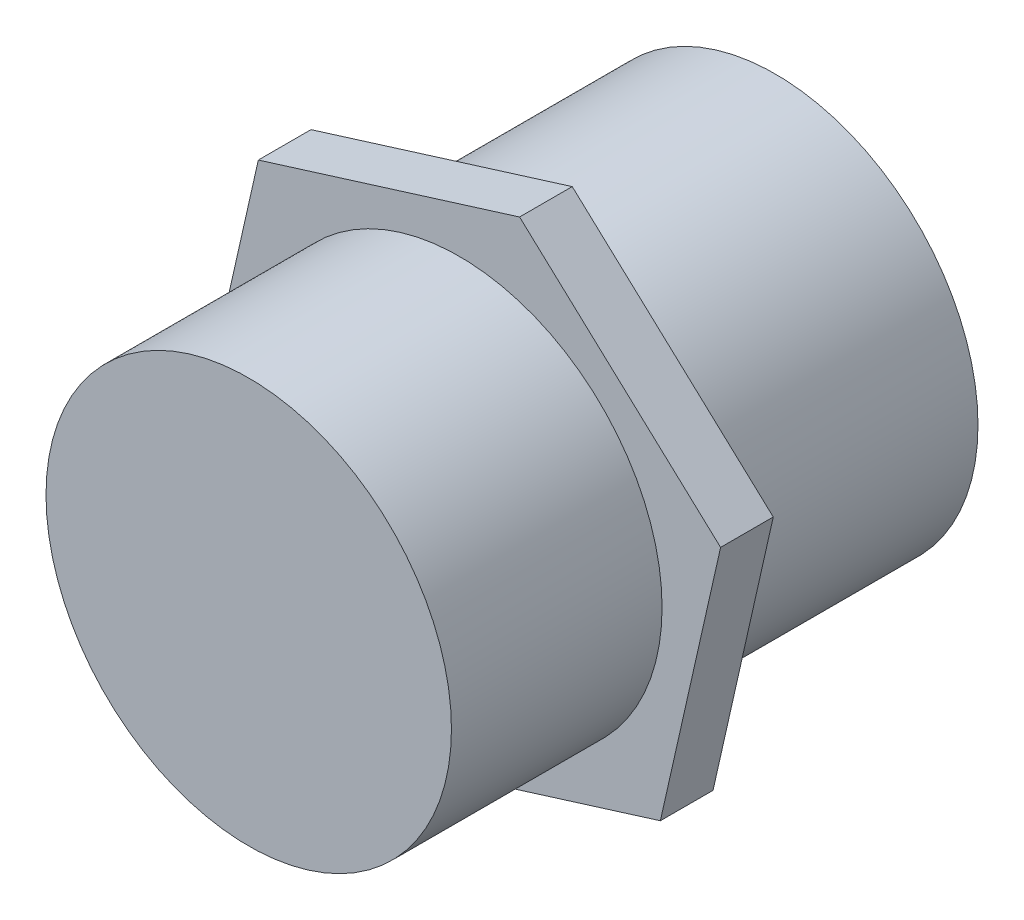
ISO-10303-21;
HEADER;
FILE_DESCRIPTION(('STEP AP214'),'2;1');
FILE_NAME('part.step','',(''),(''),'','','');
FILE_SCHEMA(('AUTOMOTIVE_DESIGN { 1 0 10303 214 1 1 1 1 }'));
ENDSEC;
DATA;
#1=APPLICATION_CONTEXT('core data for automotive mechanical design processes');
#2=APPLICATION_PROTOCOL_DEFINITION('international standard','automotive_design',2000,#1);
#3=PRODUCT_CONTEXT('',#1,'mechanical');
#4=PRODUCT('Part','Part','',(#3));
#5=PRODUCT_RELATED_PRODUCT_CATEGORY('part','',(#4));
#6=PRODUCT_DEFINITION_FORMATION('','',#4);
#7=PRODUCT_DEFINITION_CONTEXT('part definition',#1,'design');
#8=PRODUCT_DEFINITION('design','',#6,#7);
#9=PRODUCT_DEFINITION_SHAPE('','',#8);
#10=(LENGTH_UNIT() NAMED_UNIT(*) SI_UNIT(.MILLI.,.METRE.));
#11=(NAMED_UNIT(*) PLANE_ANGLE_UNIT() SI_UNIT($,.RADIAN.));
#12=(NAMED_UNIT(*) SI_UNIT($,.STERADIAN.) SOLID_ANGLE_UNIT());
#13=UNCERTAINTY_MEASURE_WITH_UNIT(LENGTH_MEASURE(1.E-05),#10,'distance_accuracy_value','');
#14=(GEOMETRIC_REPRESENTATION_CONTEXT(3) GLOBAL_UNCERTAINTY_ASSIGNED_CONTEXT((#13)) GLOBAL_UNIT_ASSIGNED_CONTEXT((#10,
#11,#12)) REPRESENTATION_CONTEXT('',''));
#15=CARTESIAN_POINT('',(0.,0.,0.));
#16=DIRECTION('',(0.,0.,1.));
#17=DIRECTION('',(1.,0.,0.));
#18=AXIS2_PLACEMENT_3D('',#15,#16,#17);
#19=CARTESIAN_POINT('',(-6.10543283287317,-6.61238912370365,2.));
#20=DIRECTION('',(0.678381425874796,0.734709902633739,0.));
#21=DIRECTION('',(-0.734709902633739,0.678381425874796,0.));
#22=AXIS2_PLACEMENT_3D('',#19,#20,#21);
#23=PLANE('',#22);
#24=DIRECTION('',(0.734709902633739,-0.678381425874796,0.));
#25=VECTOR('',#24,1.);
#26=CARTESIAN_POINT('',(-6.10543283287317,-6.61238912370365,0.));
#27=LINE('',#26,#25);
#28=CARTESIAN_POINT('',(-9.92309747343002,-3.08741583412515,0.));
#29=VERTEX_POINT('',#28);
#30=CARTESIAN_POINT('',(-2.28776819231631,-10.1373624132822,0.));
#31=VERTEX_POINT('',#30);
#32=EDGE_CURVE('E138',#29,#31,#27,.T.);
#33=ORIENTED_EDGE('',*,*,#32,.T.);
#34=DIRECTION('',(0.,0.,-1.));
#35=VECTOR('',#34,1.);
#36=CARTESIAN_POINT('',(-2.28776819231631,-10.1373624132822,2.));
#37=LINE('',#36,#35);
#38=CARTESIAN_POINT('',(-2.28776819231631,-10.1373624132822,2.));
#39=VERTEX_POINT('',#38);
#40=EDGE_CURVE('E12',#39,#31,#37,.T.);
#41=ORIENTED_EDGE('',*,*,#40,.F.);
#42=DIRECTION('',(0.734709902633739,-0.678381425874796,0.));
#43=VECTOR('',#42,1.);
#44=CARTESIAN_POINT('',(-6.10543283287317,-6.61238912370365,2.));
#45=LINE('',#44,#43);
#46=CARTESIAN_POINT('',(-9.92309747343002,-3.08741583412515,2.));
#47=VERTEX_POINT('',#46);
#48=EDGE_CURVE('E162',#47,#39,#45,.T.);
#49=ORIENTED_EDGE('',*,*,#48,.F.);
#50=DIRECTION('',(0.,0.,-1.));
#51=VECTOR('',#50,1.);
#52=CARTESIAN_POINT('',(-9.92309747343002,-3.08741583412515,2.));
#53=LINE('',#52,#51);
#54=EDGE_CURVE('E130',#47,#29,#53,.T.);
#55=ORIENTED_EDGE('',*,*,#54,.T.);
#56=EDGE_LOOP('',(#33,#41,#49,#55));
#57=FACE_BOUND('',#56,.T.);
#58=ADVANCED_FACE('F49',(#57),#23,.F.);
#59=CARTESIAN_POINT('',(2.6737805443987,-8.59365449621958,2.));
#60=DIRECTION('',(-0.297086727155411,0.954850499579953,0.));
#61=DIRECTION('',(-0.954850499579953,-0.297086727155411,0.));
#62=AXIS2_PLACEMENT_3D('',#59,#60,#61);
#63=PLANE('',#62);
#64=DIRECTION('',(0.954850499579953,0.297086727155411,0.));
#65=VECTOR('',#64,1.);
#66=CARTESIAN_POINT('',(2.6737805443987,-8.59365449621958,0.));
#67=LINE('',#66,#65);
#68=CARTESIAN_POINT('',(7.63532928111371,-7.049946579157,0.));
#69=VERTEX_POINT('',#68);
#70=EDGE_CURVE('E141',#31,#69,#67,.T.);
#71=ORIENTED_EDGE('',*,*,#70,.T.);
#72=DIRECTION('',(0.,0.,-1.));
#73=VECTOR('',#72,1.);
#74=CARTESIAN_POINT('',(7.63532928111371,-7.049946579157,2.));
#75=LINE('',#74,#73);
#76=CARTESIAN_POINT('',(7.63532928111371,-7.049946579157,2.));
#77=VERTEX_POINT('',#76);
#78=EDGE_CURVE('E58',#77,#69,#75,.T.);
#79=ORIENTED_EDGE('',*,*,#78,.F.);
#80=DIRECTION('',(0.954850499579953,0.297086727155411,0.));
#81=VECTOR('',#80,1.);
#82=CARTESIAN_POINT('',(2.6737805443987,-8.59365449621958,2.));
#83=LINE('',#82,#81);
#84=EDGE_CURVE('E103',#39,#77,#83,.T.);
#85=ORIENTED_EDGE('',*,*,#84,.F.);
#86=ORIENTED_EDGE('',*,*,#40,.T.);
#87=EDGE_LOOP('',(#71,#79,#85,#86));
#88=FACE_BOUND('',#87,.T.);
#89=ADVANCED_FACE('F176',(#88),#63,.F.);
#90=CARTESIAN_POINT('',(8.77921337727187,-1.98126537251593,2.));
#91=DIRECTION('',(-0.975468153030208,0.220140596946214,0.));
#92=DIRECTION('',(-0.220140596946214,-0.975468153030208,0.));
#93=AXIS2_PLACEMENT_3D('',#90,#91,#92);
#94=PLANE('',#93);
#95=DIRECTION('',(0.220140596946214,0.975468153030208,0.));
#96=VECTOR('',#95,1.);
#97=CARTESIAN_POINT('',(8.77921337727187,-1.98126537251593,0.));
#98=LINE('',#97,#96);
#99=CARTESIAN_POINT('',(9.92309747343002,3.08741583412515,0.));
#100=VERTEX_POINT('',#99);
#101=EDGE_CURVE('E143',#69,#100,#98,.T.);
#102=ORIENTED_EDGE('',*,*,#101,.T.);
#103=DIRECTION('',(0.,0.,-1.));
#104=VECTOR('',#103,1.);
#105=CARTESIAN_POINT('',(9.92309747343002,3.08741583412515,2.));
#106=LINE('',#105,#104);
#107=CARTESIAN_POINT('',(9.92309747343002,3.08741583412515,2.));
#108=VERTEX_POINT('',#107);
#109=EDGE_CURVE('E125',#108,#100,#106,.T.);
#110=ORIENTED_EDGE('',*,*,#109,.F.);
#111=DIRECTION('',(0.220140596946214,0.975468153030208,0.));
#112=VECTOR('',#111,1.);
#113=CARTESIAN_POINT('',(8.77921337727187,-1.98126537251593,2.));
#114=LINE('',#113,#112);
#115=EDGE_CURVE('E116',#77,#108,#114,.T.);
#116=ORIENTED_EDGE('',*,*,#115,.F.);
#117=ORIENTED_EDGE('',*,*,#78,.T.);
#118=EDGE_LOOP('',(#102,#110,#116,#117));
#119=FACE_BOUND('',#118,.T.);
#120=ADVANCED_FACE('F155',(#119),#94,.F.);
#121=CARTESIAN_POINT('',(6.10543283287317,6.61238912370365,2.));
#122=DIRECTION('',(-0.678381425874796,-0.734709902633739,0.));
#123=DIRECTION('',(0.734709902633739,-0.678381425874796,0.));
#124=AXIS2_PLACEMENT_3D('',#121,#122,#123);
#125=PLANE('',#124);
#126=DIRECTION('',(-0.734709902633739,0.678381425874796,0.));
#127=VECTOR('',#126,1.);
#128=CARTESIAN_POINT('',(6.10543283287317,6.61238912370365,0.));
#129=LINE('',#128,#127);
#130=CARTESIAN_POINT('',(2.28776819231631,10.1373624132822,0.));
#131=VERTEX_POINT('',#130);
#132=EDGE_CURVE('E124',#100,#131,#129,.T.);
#133=ORIENTED_EDGE('',*,*,#132,.T.);
#134=DIRECTION('',(0.,0.,-1.));
#135=VECTOR('',#134,1.);
#136=CARTESIAN_POINT('',(2.28776819231631,10.1373624132822,2.));
#137=LINE('',#136,#135);
#138=CARTESIAN_POINT('',(2.28776819231631,10.1373624132822,2.));
#139=VERTEX_POINT('',#138);
#140=EDGE_CURVE('E121',#139,#131,#137,.T.);
#141=ORIENTED_EDGE('',*,*,#140,.F.);
#142=DIRECTION('',(-0.734709902633739,0.678381425874796,0.));
#143=VECTOR('',#142,1.);
#144=CARTESIAN_POINT('',(6.10543283287317,6.61238912370365,2.));
#145=LINE('',#144,#143);
#146=EDGE_CURVE('E110',#108,#139,#145,.T.);
#147=ORIENTED_EDGE('',*,*,#146,.F.);
#148=ORIENTED_EDGE('',*,*,#109,.T.);
#149=EDGE_LOOP('',(#133,#141,#147,#148));
#150=FACE_BOUND('',#149,.T.);
#151=ADVANCED_FACE('F122',(#150),#125,.F.);
#152=CARTESIAN_POINT('',(-2.67378054439871,8.59365449621958,2.));
#153=DIRECTION('',(0.297086727155412,-0.954850499579953,0.));
#154=DIRECTION('',(0.954850499579953,0.297086727155412,0.));
#155=AXIS2_PLACEMENT_3D('',#152,#153,#154);
#156=PLANE('',#155);
#157=DIRECTION('',(-0.954850499579953,-0.297086727155412,0.));
#158=VECTOR('',#157,1.);
#159=CARTESIAN_POINT('',(-2.67378054439871,8.59365449621958,0.));
#160=LINE('',#159,#158);
#161=CARTESIAN_POINT('',(-7.63532928111371,7.04994657915701,0.));
#162=VERTEX_POINT('',#161);
#163=EDGE_CURVE('E89',#131,#162,#160,.T.);
#164=ORIENTED_EDGE('',*,*,#163,.T.);
#165=DIRECTION('',(0.,0.,-1.));
#166=VECTOR('',#165,1.);
#167=CARTESIAN_POINT('',(-7.63532928111371,7.04994657915701,2.));
#168=LINE('',#167,#166);
#169=CARTESIAN_POINT('',(-7.63532928111371,7.04994657915701,2.));
#170=VERTEX_POINT('',#169);
#171=EDGE_CURVE('E126',#170,#162,#168,.T.);
#172=ORIENTED_EDGE('',*,*,#171,.F.);
#173=DIRECTION('',(-0.954850499579953,-0.297086727155412,0.));
#174=VECTOR('',#173,1.);
#175=CARTESIAN_POINT('',(-2.67378054439871,8.59365449621958,2.));
#176=LINE('',#175,#174);
#177=EDGE_CURVE('E114',#139,#170,#176,.T.);
#178=ORIENTED_EDGE('',*,*,#177,.F.);
#179=ORIENTED_EDGE('',*,*,#140,.T.);
#180=EDGE_LOOP('',(#164,#172,#178,#179));
#181=FACE_BOUND('',#180,.T.);
#182=ADVANCED_FACE('F128',(#181),#156,.F.);
#183=CARTESIAN_POINT('',(0.,0.,2.));
#184=DIRECTION('',(0.,0.,-1.));
#185=DIRECTION('',(-1.,0.,0.));
#186=AXIS2_PLACEMENT_3D('',#183,#184,#185);
#187=CYLINDRICAL_SURFACE('',#186,7.7);
#188=CARTESIAN_POINT('',(0.,0.,2.));
#189=DIRECTION('',(0.,0.,1.));
#190=DIRECTION('',(1.,0.,0.));
#191=AXIS2_PLACEMENT_3D('',#188,#189,#190);
#192=CIRCLE('',#191,7.7);
#193=CARTESIAN_POINT('',(7.7,0.,2.));
#194=VERTEX_POINT('',#193);
#195=EDGE_CURVE('E149',#194,#194,#192,.T.);
#196=ORIENTED_EDGE('',*,*,#195,.T.);
#197=EDGE_LOOP('',(#196));
#198=FACE_BOUND('',#197,.T.);
#199=CARTESIAN_POINT('',(0.,0.,0.));
#200=DIRECTION('',(0.,0.,1.));
#201=DIRECTION('',(1.,0.,0.));
#202=AXIS2_PLACEMENT_3D('',#199,#200,#201);
#203=CIRCLE('',#202,7.7);
#204=CARTESIAN_POINT('',(7.7,0.,0.));
#205=VERTEX_POINT('',#204);
#206=EDGE_CURVE('E134',#205,#205,#203,.T.);
#207=ORIENTED_EDGE('',*,*,#206,.F.);
#208=EDGE_LOOP('',(#207));
#209=FACE_BOUND('',#208,.T.);
#210=ADVANCED_FACE('F51',(#198,#209),#187,.F.);
#211=CARTESIAN_POINT('',(-8.77921337727187,1.98126537251593,2.));
#212=DIRECTION('',(0.975468153030208,-0.220140596946214,0.));
#213=DIRECTION('',(0.220140596946214,0.975468153030208,0.));
#214=AXIS2_PLACEMENT_3D('',#211,#212,#213);
#215=PLANE('',#214);
#216=DIRECTION('',(-0.220140596946214,-0.975468153030208,0.));
#217=VECTOR('',#216,1.);
#218=CARTESIAN_POINT('',(-8.77921337727187,1.98126537251593,0.));
#219=LINE('',#218,#217);
#220=EDGE_CURVE('E95',#162,#29,#219,.T.);
#221=ORIENTED_EDGE('',*,*,#220,.T.);
#222=ORIENTED_EDGE('',*,*,#54,.F.);
#223=DIRECTION('',(-0.220140596946214,-0.975468153030208,0.));
#224=VECTOR('',#223,1.);
#225=CARTESIAN_POINT('',(-8.77921337727187,1.98126537251593,2.));
#226=LINE('',#225,#224);
#227=EDGE_CURVE('E66',#170,#47,#226,.T.);
#228=ORIENTED_EDGE('',*,*,#227,.F.);
#229=ORIENTED_EDGE('',*,*,#171,.T.);
#230=EDGE_LOOP('',(#221,#222,#228,#229));
#231=FACE_BOUND('',#230,.T.);
#232=ADVANCED_FACE('F163',(#231),#215,.F.);
#233=CARTESIAN_POINT('',(0.,0.,2.));
#234=DIRECTION('',(0.,0.,1.));
#235=DIRECTION('',(1.,0.,0.));
#236=AXIS2_PLACEMENT_3D('',#233,#234,#235);
#237=PLANE('',#236);
#238=ORIENTED_EDGE('',*,*,#195,.F.);
#239=EDGE_LOOP('',(#238));
#240=FACE_BOUND('',#239,.T.);
#241=ORIENTED_EDGE('',*,*,#48,.T.);
#242=ORIENTED_EDGE('',*,*,#84,.T.);
#243=ORIENTED_EDGE('',*,*,#115,.T.);
#244=ORIENTED_EDGE('',*,*,#146,.T.);
#245=ORIENTED_EDGE('',*,*,#177,.T.);
#246=ORIENTED_EDGE('',*,*,#227,.T.);
#247=EDGE_LOOP('',(#241,#242,#243,#244,#245,#246));
#248=FACE_BOUND('',#247,.T.);
#249=ADVANCED_FACE('F112',(#240,#248),#237,.T.);
#250=CARTESIAN_POINT('',(0.,0.,0.));
#251=DIRECTION('',(0.,0.,1.));
#252=DIRECTION('',(1.,0.,0.));
#253=AXIS2_PLACEMENT_3D('',#250,#251,#252);
#254=PLANE('',#253);
#255=ORIENTED_EDGE('',*,*,#206,.T.);
#256=EDGE_LOOP('',(#255));
#257=FACE_BOUND('',#256,.T.);
#258=ORIENTED_EDGE('',*,*,#32,.F.);
#259=ORIENTED_EDGE('',*,*,#220,.F.);
#260=ORIENTED_EDGE('',*,*,#163,.F.);
#261=ORIENTED_EDGE('',*,*,#132,.F.);
#262=ORIENTED_EDGE('',*,*,#101,.F.);
#263=ORIENTED_EDGE('',*,*,#70,.F.);
#264=EDGE_LOOP('',(#258,#259,#260,#261,#262,#263));
#265=FACE_BOUND('',#264,.T.);
#266=ADVANCED_FACE('F158',(#257,#265),#254,.F.);
#267=CLOSED_SHELL('',(#58,#89,#120,#151,#182,#210,#232,#249,#266));
#268=MANIFOLD_SOLID_BREP('B2',#267);
#269=CARTESIAN_POINT('',(0.,0.,-10.));
#270=DIRECTION('',(0.,0.,1.));
#271=DIRECTION('',(1.,0.,0.));
#272=AXIS2_PLACEMENT_3D('',#269,#270,#271);
#273=CYLINDRICAL_SURFACE('',#272,7.7);
#274=CARTESIAN_POINT('',(0.,0.,-10.));
#275=DIRECTION('',(0.,0.,1.));
#276=DIRECTION('',(1.,0.,0.));
#277=AXIS2_PLACEMENT_3D('',#274,#275,#276);
#278=CIRCLE('',#277,7.7);
#279=CARTESIAN_POINT('',(7.7,0.,-10.));
#280=VERTEX_POINT('',#279);
#281=EDGE_CURVE('E48',#280,#280,#278,.T.);
#282=ORIENTED_EDGE('',*,*,#281,.T.);
#283=EDGE_LOOP('',(#282));
#284=FACE_BOUND('',#283,.T.);
#285=CARTESIAN_POINT('',(0.,0.,10.));
#286=DIRECTION('',(0.,0.,1.));
#287=DIRECTION('',(1.,0.,0.));
#288=AXIS2_PLACEMENT_3D('',#285,#286,#287);
#289=CIRCLE('',#288,7.7);
#290=CARTESIAN_POINT('',(7.7,0.,10.));
#291=VERTEX_POINT('',#290);
#292=EDGE_CURVE('E273',#291,#291,#289,.T.);
#293=ORIENTED_EDGE('',*,*,#292,.F.);
#294=EDGE_LOOP('',(#293));
#295=FACE_BOUND('',#294,.T.);
#296=ADVANCED_FACE('F267',(#284,#295),#273,.T.);
#297=CARTESIAN_POINT('',(0.,0.,-10.));
#298=DIRECTION('',(0.,0.,1.));
#299=DIRECTION('',(1.,0.,0.));
#300=AXIS2_PLACEMENT_3D('',#297,#298,#299);
#301=PLANE('',#300);
#302=ORIENTED_EDGE('',*,*,#281,.F.);
#303=EDGE_LOOP('',(#302));
#304=FACE_BOUND('',#303,.T.);
#305=ADVANCED_FACE('F282',(#304),#301,.F.);
#306=CARTESIAN_POINT('',(0.,0.,10.));
#307=DIRECTION('',(0.,0.,1.));
#308=DIRECTION('',(1.,0.,0.));
#309=AXIS2_PLACEMENT_3D('',#306,#307,#308);
#310=PLANE('',#309);
#311=ORIENTED_EDGE('',*,*,#292,.T.);
#312=EDGE_LOOP('',(#311));
#313=FACE_BOUND('',#312,.T.);
#314=ADVANCED_FACE('F279',(#313),#310,.T.);
#315=CLOSED_SHELL('',(#296,#305,#314));
#316=MANIFOLD_SOLID_BREP('B6',#315);
#317=ADVANCED_BREP_SHAPE_REPRESENTATION('',(#18,#268,#316),#14);
#318=SHAPE_DEFINITION_REPRESENTATION(#9,#317);
ENDSEC;
END-ISO-10303-21;
